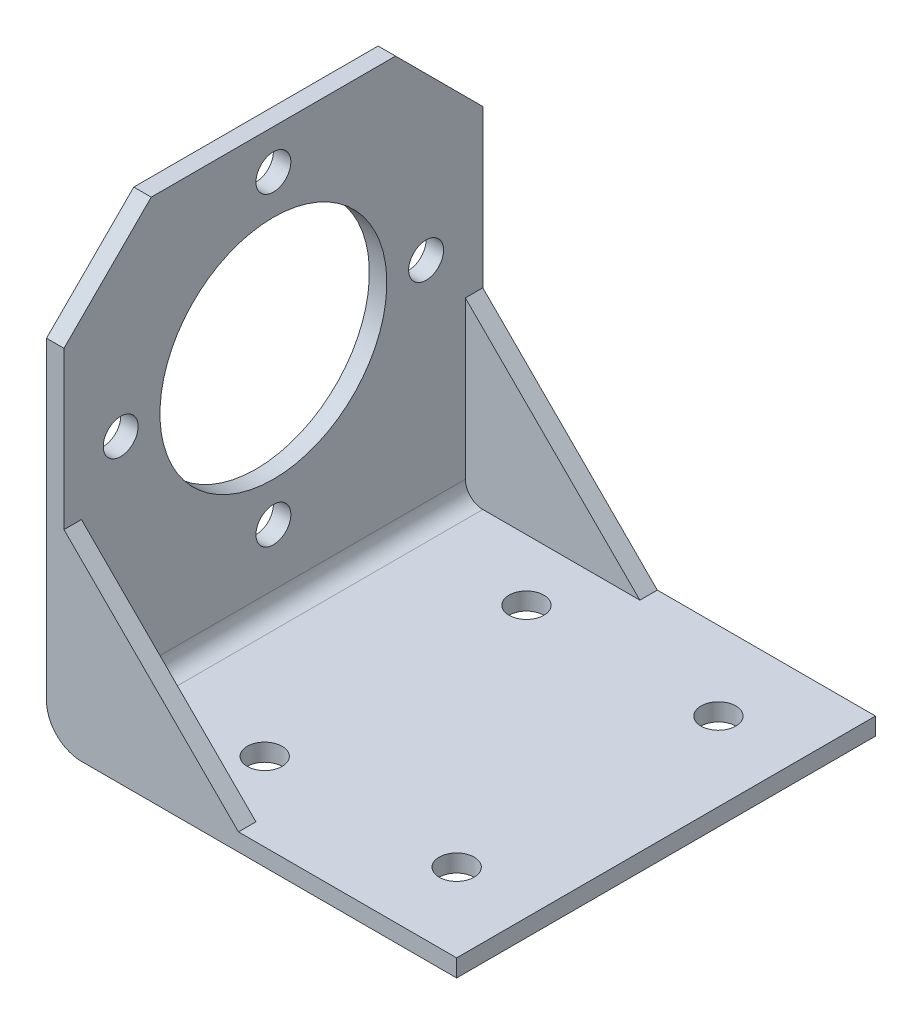
ISO-10303-21;
HEADER;
FILE_DESCRIPTION(('STEP AP214'),'2;1');
FILE_NAME('part.step','',(''),(''),'','','');
FILE_SCHEMA(('AUTOMOTIVE_DESIGN { 1 0 10303 214 1 1 1 1 }'));
ENDSEC;
DATA;
#1=APPLICATION_CONTEXT('core data for automotive mechanical design processes');
#2=APPLICATION_PROTOCOL_DEFINITION('international standard','automotive_design',2000,#1);
#3=PRODUCT_CONTEXT('',#1,'mechanical');
#4=PRODUCT('Part','Part','',(#3));
#5=PRODUCT_RELATED_PRODUCT_CATEGORY('part','',(#4));
#6=PRODUCT_DEFINITION_FORMATION('','',#4);
#7=PRODUCT_DEFINITION_CONTEXT('part definition',#1,'design');
#8=PRODUCT_DEFINITION('design','',#6,#7);
#9=PRODUCT_DEFINITION_SHAPE('','',#8);
#10=(LENGTH_UNIT() NAMED_UNIT(*) SI_UNIT(.MILLI.,.METRE.));
#11=(NAMED_UNIT(*) PLANE_ANGLE_UNIT() SI_UNIT($,.RADIAN.));
#12=(NAMED_UNIT(*) SI_UNIT($,.STERADIAN.) SOLID_ANGLE_UNIT());
#13=UNCERTAINTY_MEASURE_WITH_UNIT(LENGTH_MEASURE(1.E-05),#10,'distance_accuracy_value','');
#14=(GEOMETRIC_REPRESENTATION_CONTEXT(3) GLOBAL_UNCERTAINTY_ASSIGNED_CONTEXT((#13)) GLOBAL_UNIT_ASSIGNED_CONTEXT((#10,
#11,#12)) REPRESENTATION_CONTEXT('',''));
#15=CARTESIAN_POINT('',(0.,0.,0.));
#16=DIRECTION('',(0.,0.,1.));
#17=DIRECTION('',(1.,0.,0.));
#18=AXIS2_PLACEMENT_3D('',#15,#16,#17);
#19=CARTESIAN_POINT('',(4.,4.,48.));
#20=DIRECTION('',(0.,0.,-1.));
#21=DIRECTION('',(-1.,0.,0.));
#22=AXIS2_PLACEMENT_3D('',#19,#20,#21);
#23=CYLINDRICAL_SURFACE('',#22,2.);
#24=DIRECTION('',(0.,0.,-1.));
#25=VECTOR('',#24,1.);
#26=CARTESIAN_POINT('',(4.,2.,48.));
#27=LINE('',#26,#25);
#28=CARTESIAN_POINT('',(4.,2.,46.));
#29=VERTEX_POINT('',#28);
#30=CARTESIAN_POINT('',(4.,2.,2.));
#31=VERTEX_POINT('',#30);
#32=EDGE_CURVE('E290',#29,#31,#27,.T.);
#33=ORIENTED_EDGE('',*,*,#32,.T.);
#34=CARTESIAN_POINT('',(4.,4.,2.));
#35=DIRECTION('',(0.,0.,1.));
#36=DIRECTION('',(1.,0.,0.));
#37=AXIS2_PLACEMENT_3D('',#34,#35,#36);
#38=CIRCLE('',#37,2.);
#39=CARTESIAN_POINT('',(2.,4.,2.));
#40=VERTEX_POINT('',#39);
#41=EDGE_CURVE('E181',#40,#31,#38,.T.);
#42=ORIENTED_EDGE('',*,*,#41,.F.);
#43=DIRECTION('',(0.,0.,-1.));
#44=VECTOR('',#43,1.);
#45=CARTESIAN_POINT('',(2.,4.,48.));
#46=LINE('',#45,#44);
#47=CARTESIAN_POINT('',(2.,4.,46.));
#48=VERTEX_POINT('',#47);
#49=EDGE_CURVE('E185',#48,#40,#46,.T.);
#50=ORIENTED_EDGE('',*,*,#49,.F.);
#51=CARTESIAN_POINT('',(4.,4.,46.));
#52=DIRECTION('',(0.,0.,1.));
#53=DIRECTION('',(1.,0.,0.));
#54=AXIS2_PLACEMENT_3D('',#51,#52,#53);
#55=CIRCLE('',#54,2.);
#56=EDGE_CURVE('E69',#48,#29,#55,.T.);
#57=ORIENTED_EDGE('',*,*,#56,.T.);
#58=EDGE_LOOP('',(#33,#42,#50,#57));
#59=FACE_BOUND('',#58,.T.);
#60=ADVANCED_FACE('F45',(#59),#23,.F.);
#61=CARTESIAN_POINT('',(0.,2.,48.));
#62=DIRECTION('',(0.,1.,0.));
#63=DIRECTION('',(0.,0.,1.));
#64=AXIS2_PLACEMENT_3D('',#61,#62,#63);
#65=PLANE('',#64);
#66=CARTESIAN_POINT('',(38.,2.,39.));
#67=DIRECTION('',(0.,1.,0.));
#68=DIRECTION('',(0.,0.,-1.));
#69=AXIS2_PLACEMENT_3D('',#66,#67,#68);
#70=CIRCLE('',#69,2.);
#71=CARTESIAN_POINT('',(38.,2.,37.));
#72=VERTEX_POINT('',#71);
#73=EDGE_CURVE('E228',#72,#72,#70,.T.);
#74=ORIENTED_EDGE('',*,*,#73,.F.);
#75=EDGE_LOOP('',(#74));
#76=FACE_BOUND('',#75,.T.);
#77=CARTESIAN_POINT('',(16.,2.,9.));
#78=DIRECTION('',(0.,1.,0.));
#79=DIRECTION('',(0.,0.,1.));
#80=AXIS2_PLACEMENT_3D('',#77,#78,#79);
#81=CIRCLE('',#80,2.);
#82=CARTESIAN_POINT('',(16.,2.,11.));
#83=VERTEX_POINT('',#82);
#84=EDGE_CURVE('E226',#83,#83,#81,.T.);
#85=ORIENTED_EDGE('',*,*,#84,.F.);
#86=EDGE_LOOP('',(#85));
#87=FACE_BOUND('',#86,.T.);
#88=CARTESIAN_POINT('',(16.,2.,39.));
#89=DIRECTION('',(0.,1.,0.));
#90=DIRECTION('',(0.,0.,-1.));
#91=AXIS2_PLACEMENT_3D('',#88,#89,#90);
#92=CIRCLE('',#91,2.);
#93=CARTESIAN_POINT('',(16.,2.,37.));
#94=VERTEX_POINT('',#93);
#95=EDGE_CURVE('E223',#94,#94,#92,.T.);
#96=ORIENTED_EDGE('',*,*,#95,.F.);
#97=EDGE_LOOP('',(#96));
#98=FACE_BOUND('',#97,.T.);
#99=CARTESIAN_POINT('',(38.,2.,9.));
#100=DIRECTION('',(0.,1.,0.));
#101=DIRECTION('',(0.,0.,1.));
#102=AXIS2_PLACEMENT_3D('',#99,#100,#101);
#103=CIRCLE('',#102,2.);
#104=CARTESIAN_POINT('',(38.,2.,11.));
#105=VERTEX_POINT('',#104);
#106=EDGE_CURVE('E231',#105,#105,#103,.T.);
#107=ORIENTED_EDGE('',*,*,#106,.F.);
#108=EDGE_LOOP('',(#107));
#109=FACE_BOUND('',#108,.T.);
#110=DIRECTION('',(1.,0.,0.));
#111=VECTOR('',#110,1.);
#112=CARTESIAN_POINT('',(0.,2.,0.));
#113=LINE('',#112,#111);
#114=CARTESIAN_POINT('',(22.,2.,0.));
#115=VERTEX_POINT('',#114);
#116=CARTESIAN_POINT('',(47.,2.,0.));
#117=VERTEX_POINT('',#116);
#118=EDGE_CURVE('E270',#115,#117,#113,.T.);
#119=ORIENTED_EDGE('',*,*,#118,.F.);
#120=DIRECTION('',(0.,0.,-1.));
#121=VECTOR('',#120,1.);
#122=CARTESIAN_POINT('',(22.,2.,2.));
#123=LINE('',#122,#121);
#124=CARTESIAN_POINT('',(22.,2.,2.));
#125=VERTEX_POINT('',#124);
#126=EDGE_CURVE('E180',#125,#115,#123,.T.);
#127=ORIENTED_EDGE('',*,*,#126,.F.);
#128=DIRECTION('',(1.,0.,0.));
#129=VECTOR('',#128,1.);
#130=CARTESIAN_POINT('',(4.,2.,2.));
#131=LINE('',#130,#129);
#132=EDGE_CURVE('E168',#31,#125,#131,.T.);
#133=ORIENTED_EDGE('',*,*,#132,.F.);
#134=ORIENTED_EDGE('',*,*,#32,.F.);
#135=DIRECTION('',(1.,0.,0.));
#136=VECTOR('',#135,1.);
#137=CARTESIAN_POINT('',(4.,2.,46.));
#138=LINE('',#137,#136);
#139=CARTESIAN_POINT('',(22.,2.,46.));
#140=VERTEX_POINT('',#139);
#141=EDGE_CURVE('E61',#29,#140,#138,.T.);
#142=ORIENTED_EDGE('',*,*,#141,.T.);
#143=DIRECTION('',(0.,0.,1.));
#144=VECTOR('',#143,1.);
#145=CARTESIAN_POINT('',(22.,2.,46.));
#146=LINE('',#145,#144);
#147=CARTESIAN_POINT('',(22.,2.,48.));
#148=VERTEX_POINT('',#147);
#149=EDGE_CURVE('E200',#140,#148,#146,.T.);
#150=ORIENTED_EDGE('',*,*,#149,.T.);
#151=DIRECTION('',(1.,0.,0.));
#152=VECTOR('',#151,1.);
#153=CARTESIAN_POINT('',(0.,2.,48.));
#154=LINE('',#153,#152);
#155=CARTESIAN_POINT('',(47.,2.,48.));
#156=VERTEX_POINT('',#155);
#157=EDGE_CURVE('E255',#148,#156,#154,.T.);
#158=ORIENTED_EDGE('',*,*,#157,.T.);
#159=DIRECTION('',(0.,0.,-1.));
#160=VECTOR('',#159,1.);
#161=CARTESIAN_POINT('',(47.,2.,48.));
#162=LINE('',#161,#160);
#163=EDGE_CURVE('E292',#156,#117,#162,.T.);
#164=ORIENTED_EDGE('',*,*,#163,.T.);
#165=EDGE_LOOP('',(#119,#127,#133,#134,#142,#150,#158,#164));
#166=FACE_BOUND('',#165,.T.);
#167=ADVANCED_FACE('F366',(#76,#87,#98,#109,#166),#65,.T.);
#168=CARTESIAN_POINT('',(2.,50.,48.));
#169=DIRECTION('',(1.,0.,0.));
#170=DIRECTION('',(0.,1.,0.));
#171=AXIS2_PLACEMENT_3D('',#168,#169,#170);
#172=PLANE('',#171);
#173=CARTESIAN_POINT('',(2.,45.5,24.));
#174=DIRECTION('',(1.,0.,0.));
#175=DIRECTION('',(0.,1.,0.));
#176=AXIS2_PLACEMENT_3D('',#173,#174,#175);
#177=CIRCLE('',#176,2.);
#178=CARTESIAN_POINT('',(2.,47.5,24.));
#179=VERTEX_POINT('',#178);
#180=EDGE_CURVE('E214',#179,#179,#177,.T.);
#181=ORIENTED_EDGE('',*,*,#180,.F.);
#182=EDGE_LOOP('',(#181));
#183=FACE_BOUND('',#182,.T.);
#184=CARTESIAN_POINT('',(2.,28.,6.5));
#185=DIRECTION('',(1.,0.,0.));
#186=DIRECTION('',(0.,1.,0.));
#187=AXIS2_PLACEMENT_3D('',#184,#185,#186);
#188=CIRCLE('',#187,2.);
#189=CARTESIAN_POINT('',(2.,30.,6.5));
#190=VERTEX_POINT('',#189);
#191=EDGE_CURVE('E211',#190,#190,#188,.T.);
#192=ORIENTED_EDGE('',*,*,#191,.F.);
#193=EDGE_LOOP('',(#192));
#194=FACE_BOUND('',#193,.T.);
#195=CARTESIAN_POINT('',(2.,10.5,24.));
#196=DIRECTION('',(1.,0.,0.));
#197=DIRECTION('',(0.,1.,0.));
#198=AXIS2_PLACEMENT_3D('',#195,#196,#197);
#199=CIRCLE('',#198,2.);
#200=CARTESIAN_POINT('',(2.,12.5,24.));
#201=VERTEX_POINT('',#200);
#202=EDGE_CURVE('E208',#201,#201,#199,.T.);
#203=ORIENTED_EDGE('',*,*,#202,.F.);
#204=EDGE_LOOP('',(#203));
#205=FACE_BOUND('',#204,.T.);
#206=CARTESIAN_POINT('',(2.,28.,41.5));
#207=DIRECTION('',(1.,0.,0.));
#208=DIRECTION('',(0.,1.,0.));
#209=AXIS2_PLACEMENT_3D('',#206,#207,#208);
#210=CIRCLE('',#209,2.);
#211=CARTESIAN_POINT('',(2.,30.,41.5));
#212=VERTEX_POINT('',#211);
#213=EDGE_CURVE('E206',#212,#212,#210,.T.);
#214=ORIENTED_EDGE('',*,*,#213,.F.);
#215=EDGE_LOOP('',(#214));
#216=FACE_BOUND('',#215,.T.);
#217=CARTESIAN_POINT('',(2.,28.,24.));
#218=DIRECTION('',(1.,0.,0.));
#219=DIRECTION('',(0.,1.,0.));
#220=AXIS2_PLACEMENT_3D('',#217,#218,#219);
#221=CIRCLE('',#220,13.);
#222=CARTESIAN_POINT('',(2.,41.,24.));
#223=VERTEX_POINT('',#222);
#224=EDGE_CURVE('E217',#223,#223,#221,.T.);
#225=ORIENTED_EDGE('',*,*,#224,.F.);
#226=EDGE_LOOP('',(#225));
#227=FACE_BOUND('',#226,.T.);
#228=DIRECTION('',(0.,-1.,0.));
#229=VECTOR('',#228,1.);
#230=CARTESIAN_POINT('',(2.,22.,2.));
#231=LINE('',#230,#229);
#232=CARTESIAN_POINT('',(2.,22.,2.));
#233=VERTEX_POINT('',#232);
#234=EDGE_CURVE('E165',#233,#40,#231,.T.);
#235=ORIENTED_EDGE('',*,*,#234,.F.);
#236=DIRECTION('',(0.,0.,-1.));
#237=VECTOR('',#236,1.);
#238=CARTESIAN_POINT('',(2.,22.,2.));
#239=LINE('',#238,#237);
#240=CARTESIAN_POINT('',(2.,22.,0.));
#241=VERTEX_POINT('',#240);
#242=EDGE_CURVE('E173',#233,#241,#239,.T.);
#243=ORIENTED_EDGE('',*,*,#242,.T.);
#244=DIRECTION('',(0.,-1.,0.));
#245=VECTOR('',#244,1.);
#246=CARTESIAN_POINT('',(2.,50.,0.));
#247=LINE('',#246,#245);
#248=CARTESIAN_POINT('',(2.,40.,0.));
#249=VERTEX_POINT('',#248);
#250=EDGE_CURVE('E272',#249,#241,#247,.T.);
#251=ORIENTED_EDGE('',*,*,#250,.F.);
#252=DIRECTION('',(0.,0.707106781186547,0.707106781186548));
#253=VECTOR('',#252,1.);
#254=CARTESIAN_POINT('',(2.,69.,29.0000000000001));
#255=LINE('',#254,#253);
#256=CARTESIAN_POINT('',(2.,50.,10.));
#257=VERTEX_POINT('',#256);
#258=EDGE_CURVE('E324',#249,#257,#255,.T.);
#259=ORIENTED_EDGE('',*,*,#258,.T.);
#260=DIRECTION('',(0.,0.,-1.));
#261=VECTOR('',#260,1.);
#262=CARTESIAN_POINT('',(2.,50.,48.));
#263=LINE('',#262,#261);
#264=CARTESIAN_POINT('',(2.,50.,38.));
#265=VERTEX_POINT('',#264);
#266=EDGE_CURVE('E286',#265,#257,#263,.T.);
#267=ORIENTED_EDGE('',*,*,#266,.F.);
#268=DIRECTION('',(0.,0.707106781186548,-0.707106781186547));
#269=VECTOR('',#268,1.);
#270=CARTESIAN_POINT('',(2.,45.,43.));
#271=LINE('',#270,#269);
#272=CARTESIAN_POINT('',(2.,40.,48.));
#273=VERTEX_POINT('',#272);
#274=EDGE_CURVE('E326',#265,#273,#271,.F.);
#275=ORIENTED_EDGE('',*,*,#274,.T.);
#276=DIRECTION('',(0.,-1.,0.));
#277=VECTOR('',#276,1.);
#278=CARTESIAN_POINT('',(2.,50.,48.));
#279=LINE('',#278,#277);
#280=CARTESIAN_POINT('',(2.,22.,48.));
#281=VERTEX_POINT('',#280);
#282=EDGE_CURVE('E257',#273,#281,#279,.T.);
#283=ORIENTED_EDGE('',*,*,#282,.T.);
#284=DIRECTION('',(0.,0.,1.));
#285=VECTOR('',#284,1.);
#286=CARTESIAN_POINT('',(2.,22.,46.));
#287=LINE('',#286,#285);
#288=CARTESIAN_POINT('',(2.,22.,46.));
#289=VERTEX_POINT('',#288);
#290=EDGE_CURVE('E203',#289,#281,#287,.T.);
#291=ORIENTED_EDGE('',*,*,#290,.F.);
#292=DIRECTION('',(0.,-1.,0.));
#293=VECTOR('',#292,1.);
#294=CARTESIAN_POINT('',(2.,22.,46.));
#295=LINE('',#294,#293);
#296=EDGE_CURVE('E193',#289,#48,#295,.T.);
#297=ORIENTED_EDGE('',*,*,#296,.T.);
#298=ORIENTED_EDGE('',*,*,#49,.T.);
#299=EDGE_LOOP('',(#235,#243,#251,#259,#267,#275,#283,#291,#297,#298));
#300=FACE_BOUND('',#299,.T.);
#301=ADVANCED_FACE('F184',(#183,#194,#205,#216,#227,#300),#172,.T.);
#302=CARTESIAN_POINT('',(0.,0.,48.));
#303=DIRECTION('',(0.,1.,0.));
#304=DIRECTION('',(0.,0.,1.));
#305=AXIS2_PLACEMENT_3D('',#302,#303,#304);
#306=PLANE('',#305);
#307=CARTESIAN_POINT('',(38.,0.,39.));
#308=DIRECTION('',(0.,1.,0.));
#309=DIRECTION('',(0.,0.,1.));
#310=AXIS2_PLACEMENT_3D('',#307,#308,#309);
#311=CIRCLE('',#310,2.);
#312=CARTESIAN_POINT('',(38.,0.,41.));
#313=VERTEX_POINT('',#312);
#314=EDGE_CURVE('E245',#313,#313,#311,.T.);
#315=ORIENTED_EDGE('',*,*,#314,.T.);
#316=EDGE_LOOP('',(#315));
#317=FACE_BOUND('',#316,.T.);
#318=CARTESIAN_POINT('',(16.,0.,9.));
#319=DIRECTION('',(0.,1.,0.));
#320=DIRECTION('',(0.,0.,1.));
#321=AXIS2_PLACEMENT_3D('',#318,#319,#320);
#322=CIRCLE('',#321,2.);
#323=CARTESIAN_POINT('',(16.,0.,11.));
#324=VERTEX_POINT('',#323);
#325=EDGE_CURVE('E242',#324,#324,#322,.T.);
#326=ORIENTED_EDGE('',*,*,#325,.T.);
#327=EDGE_LOOP('',(#326));
#328=FACE_BOUND('',#327,.T.);
#329=CARTESIAN_POINT('',(16.,0.,39.));
#330=DIRECTION('',(0.,1.,0.));
#331=DIRECTION('',(0.,0.,1.));
#332=AXIS2_PLACEMENT_3D('',#329,#330,#331);
#333=CIRCLE('',#332,2.);
#334=CARTESIAN_POINT('',(16.,0.,41.));
#335=VERTEX_POINT('',#334);
#336=EDGE_CURVE('E239',#335,#335,#333,.T.);
#337=ORIENTED_EDGE('',*,*,#336,.T.);
#338=EDGE_LOOP('',(#337));
#339=FACE_BOUND('',#338,.T.);
#340=CARTESIAN_POINT('',(38.,0.,9.));
#341=DIRECTION('',(0.,1.,0.));
#342=DIRECTION('',(0.,0.,1.));
#343=AXIS2_PLACEMENT_3D('',#340,#341,#342);
#344=CIRCLE('',#343,2.);
#345=CARTESIAN_POINT('',(38.,0.,11.));
#346=VERTEX_POINT('',#345);
#347=EDGE_CURVE('E236',#346,#346,#344,.T.);
#348=ORIENTED_EDGE('',*,*,#347,.T.);
#349=EDGE_LOOP('',(#348));
#350=FACE_BOUND('',#349,.T.);
#351=DIRECTION('',(1.,0.,0.));
#352=VECTOR('',#351,1.);
#353=CARTESIAN_POINT('',(0.,0.,0.));
#354=LINE('',#353,#352);
#355=CARTESIAN_POINT('',(4.,0.,0.));
#356=VERTEX_POINT('',#355);
#357=CARTESIAN_POINT('',(47.,0.,0.));
#358=VERTEX_POINT('',#357);
#359=EDGE_CURVE('E248',#356,#358,#354,.T.);
#360=ORIENTED_EDGE('',*,*,#359,.T.);
#361=DIRECTION('',(0.,0.,-1.));
#362=VECTOR('',#361,1.);
#363=CARTESIAN_POINT('',(47.,0.,48.));
#364=LINE('',#363,#362);
#365=CARTESIAN_POINT('',(47.,0.,48.));
#366=VERTEX_POINT('',#365);
#367=EDGE_CURVE('E295',#366,#358,#364,.T.);
#368=ORIENTED_EDGE('',*,*,#367,.F.);
#369=DIRECTION('',(1.,0.,0.));
#370=VECTOR('',#369,1.);
#371=CARTESIAN_POINT('',(0.,0.,48.));
#372=LINE('',#371,#370);
#373=CARTESIAN_POINT('',(4.,0.,48.));
#374=VERTEX_POINT('',#373);
#375=EDGE_CURVE('E249',#374,#366,#372,.T.);
#376=ORIENTED_EDGE('',*,*,#375,.F.);
#377=DIRECTION('',(0.,0.,-1.));
#378=VECTOR('',#377,1.);
#379=CARTESIAN_POINT('',(4.,0.,48.));
#380=LINE('',#379,#378);
#381=EDGE_CURVE('E264',#374,#356,#380,.T.);
#382=ORIENTED_EDGE('',*,*,#381,.T.);
#383=EDGE_LOOP('',(#360,#368,#376,#382));
#384=FACE_BOUND('',#383,.T.);
#385=ADVANCED_FACE('F379',(#317,#328,#339,#350,#384),#306,.F.);
#386=CARTESIAN_POINT('',(47.,2.,48.));
#387=DIRECTION('',(1.,0.,0.));
#388=DIRECTION('',(0.,0.,-1.));
#389=AXIS2_PLACEMENT_3D('',#386,#387,#388);
#390=PLANE('',#389);
#391=DIRECTION('',(0.,-1.,0.));
#392=VECTOR('',#391,1.);
#393=CARTESIAN_POINT('',(47.,2.,0.));
#394=LINE('',#393,#392);
#395=EDGE_CURVE('E267',#117,#358,#394,.T.);
#396=ORIENTED_EDGE('',*,*,#395,.F.);
#397=ORIENTED_EDGE('',*,*,#163,.F.);
#398=DIRECTION('',(0.,-1.,0.));
#399=VECTOR('',#398,1.);
#400=CARTESIAN_POINT('',(47.,2.,48.));
#401=LINE('',#400,#399);
#402=EDGE_CURVE('E251',#156,#366,#401,.T.);
#403=ORIENTED_EDGE('',*,*,#402,.T.);
#404=ORIENTED_EDGE('',*,*,#367,.T.);
#405=EDGE_LOOP('',(#396,#397,#403,#404));
#406=FACE_BOUND('',#405,.T.);
#407=ADVANCED_FACE('F376',(#406),#390,.T.);
#408=CARTESIAN_POINT('',(0.,50.,48.));
#409=DIRECTION('',(0.,1.,0.));
#410=DIRECTION('',(0.,0.,1.));
#411=AXIS2_PLACEMENT_3D('',#408,#409,#410);
#412=PLANE('',#411);
#413=DIRECTION('',(0.,0.,-1.));
#414=VECTOR('',#413,1.);
#415=CARTESIAN_POINT('',(0.,50.,48.));
#416=LINE('',#415,#414);
#417=CARTESIAN_POINT('',(0.,50.,38.));
#418=VERTEX_POINT('',#417);
#419=CARTESIAN_POINT('',(0.,50.,10.));
#420=VERTEX_POINT('',#419);
#421=EDGE_CURVE('E283',#418,#420,#416,.T.);
#422=ORIENTED_EDGE('',*,*,#421,.F.);
#423=DIRECTION('',(1.,0.,0.));
#424=VECTOR('',#423,1.);
#425=CARTESIAN_POINT('',(0.,50.,38.));
#426=LINE('',#425,#424);
#427=EDGE_CURVE('E321',#418,#265,#426,.T.);
#428=ORIENTED_EDGE('',*,*,#427,.T.);
#429=ORIENTED_EDGE('',*,*,#266,.T.);
#430=DIRECTION('',(-1.,0.,0.));
#431=VECTOR('',#430,1.);
#432=CARTESIAN_POINT('',(0.,50.,10.));
#433=LINE('',#432,#431);
#434=EDGE_CURVE('E306',#257,#420,#433,.T.);
#435=ORIENTED_EDGE('',*,*,#434,.T.);
#436=EDGE_LOOP('',(#422,#428,#429,#435));
#437=FACE_BOUND('',#436,.T.);
#438=ADVANCED_FACE('F342',(#437),#412,.T.);
#439=CARTESIAN_POINT('',(0.,50.,48.));
#440=DIRECTION('',(1.,0.,0.));
#441=DIRECTION('',(0.,1.,0.));
#442=AXIS2_PLACEMENT_3D('',#439,#440,#441);
#443=PLANE('',#442);
#444=CARTESIAN_POINT('',(0.,45.5,24.));
#445=DIRECTION('',(1.,0.,0.));
#446=DIRECTION('',(0.,1.,0.));
#447=AXIS2_PLACEMENT_3D('',#444,#445,#446);
#448=CIRCLE('',#447,2.);
#449=CARTESIAN_POINT('',(0.,47.5,24.));
#450=VERTEX_POINT('',#449);
#451=EDGE_CURVE('E227',#450,#450,#448,.T.);
#452=ORIENTED_EDGE('',*,*,#451,.T.);
#453=EDGE_LOOP('',(#452));
#454=FACE_BOUND('',#453,.T.);
#455=CARTESIAN_POINT('',(0.,28.,6.5));
#456=DIRECTION('',(1.,0.,0.));
#457=DIRECTION('',(0.,1.,0.));
#458=AXIS2_PLACEMENT_3D('',#455,#456,#457);
#459=CIRCLE('',#458,2.);
#460=CARTESIAN_POINT('',(0.,30.,6.5));
#461=VERTEX_POINT('',#460);
#462=EDGE_CURVE('E315',#461,#461,#459,.T.);
#463=ORIENTED_EDGE('',*,*,#462,.T.);
#464=EDGE_LOOP('',(#463));
#465=FACE_BOUND('',#464,.T.);
#466=CARTESIAN_POINT('',(0.,10.5,24.));
#467=DIRECTION('',(1.,0.,0.));
#468=DIRECTION('',(0.,1.,0.));
#469=AXIS2_PLACEMENT_3D('',#466,#467,#468);
#470=CIRCLE('',#469,2.);
#471=CARTESIAN_POINT('',(0.,12.5,24.));
#472=VERTEX_POINT('',#471);
#473=EDGE_CURVE('E312',#472,#472,#470,.T.);
#474=ORIENTED_EDGE('',*,*,#473,.T.);
#475=EDGE_LOOP('',(#474));
#476=FACE_BOUND('',#475,.T.);
#477=CARTESIAN_POINT('',(0.,28.,41.5));
#478=DIRECTION('',(1.,0.,0.));
#479=DIRECTION('',(0.,1.,0.));
#480=AXIS2_PLACEMENT_3D('',#477,#478,#479);
#481=CIRCLE('',#480,2.);
#482=CARTESIAN_POINT('',(0.,30.,41.5));
#483=VERTEX_POINT('',#482);
#484=EDGE_CURVE('E309',#483,#483,#481,.T.);
#485=ORIENTED_EDGE('',*,*,#484,.T.);
#486=EDGE_LOOP('',(#485));
#487=FACE_BOUND('',#486,.T.);
#488=CARTESIAN_POINT('',(0.,28.,24.));
#489=DIRECTION('',(1.,0.,0.));
#490=DIRECTION('',(0.,1.,0.));
#491=AXIS2_PLACEMENT_3D('',#488,#489,#490);
#492=CIRCLE('',#491,13.);
#493=CARTESIAN_POINT('',(0.,41.,24.));
#494=VERTEX_POINT('',#493);
#495=EDGE_CURVE('E222',#494,#494,#492,.T.);
#496=ORIENTED_EDGE('',*,*,#495,.T.);
#497=EDGE_LOOP('',(#496));
#498=FACE_BOUND('',#497,.T.);
#499=DIRECTION('',(0.,-1.,0.));
#500=VECTOR('',#499,1.);
#501=CARTESIAN_POINT('',(0.,50.,48.));
#502=LINE('',#501,#500);
#503=CARTESIAN_POINT('',(0.,40.,48.));
#504=VERTEX_POINT('',#503);
#505=CARTESIAN_POINT('',(0.,4.,48.));
#506=VERTEX_POINT('',#505);
#507=EDGE_CURVE('E259',#504,#506,#502,.T.);
#508=ORIENTED_EDGE('',*,*,#507,.F.);
#509=DIRECTION('',(0.,-0.707106781186548,0.707106781186547));
#510=VECTOR('',#509,1.);
#511=CARTESIAN_POINT('',(0.,50.,38.));
#512=LINE('',#511,#510);
#513=EDGE_CURVE('E54',#504,#418,#512,.F.);
#514=ORIENTED_EDGE('',*,*,#513,.T.);
#515=ORIENTED_EDGE('',*,*,#421,.T.);
#516=DIRECTION('',(0.,-0.707106781186547,-0.707106781186548));
#517=VECTOR('',#516,1.);
#518=CARTESIAN_POINT('',(0.,40.,0.));
#519=LINE('',#518,#517);
#520=CARTESIAN_POINT('',(0.,40.,0.));
#521=VERTEX_POINT('',#520);
#522=EDGE_CURVE('E330',#420,#521,#519,.T.);
#523=ORIENTED_EDGE('',*,*,#522,.T.);
#524=DIRECTION('',(0.,-1.,0.));
#525=VECTOR('',#524,1.);
#526=CARTESIAN_POINT('',(0.,50.,0.));
#527=LINE('',#526,#525);
#528=CARTESIAN_POINT('',(0.,4.,0.));
#529=VERTEX_POINT('',#528);
#530=EDGE_CURVE('E274',#521,#529,#527,.T.);
#531=ORIENTED_EDGE('',*,*,#530,.T.);
#532=DIRECTION('',(0.,0.,-1.));
#533=VECTOR('',#532,1.);
#534=CARTESIAN_POINT('',(0.,4.,48.));
#535=LINE('',#534,#533);
#536=EDGE_CURVE('E280',#506,#529,#535,.T.);
#537=ORIENTED_EDGE('',*,*,#536,.F.);
#538=EDGE_LOOP('',(#508,#514,#515,#523,#531,#537));
#539=FACE_BOUND('',#538,.T.);
#540=ADVANCED_FACE('F335',(#454,#465,#476,#487,#498,#539),#443,.F.);
#541=CARTESIAN_POINT('',(4.,4.,48.));
#542=DIRECTION('',(0.,0.,-1.));
#543=DIRECTION('',(-1.,0.,0.));
#544=AXIS2_PLACEMENT_3D('',#541,#542,#543);
#545=CYLINDRICAL_SURFACE('',#544,4.);
#546=CARTESIAN_POINT('',(4.,4.,0.));
#547=DIRECTION('',(0.,0.,-1.));
#548=DIRECTION('',(-1.,0.,0.));
#549=AXIS2_PLACEMENT_3D('',#546,#547,#548);
#550=CIRCLE('',#549,4.);
#551=EDGE_CURVE('E252',#529,#356,#550,.F.);
#552=ORIENTED_EDGE('',*,*,#551,.T.);
#553=ORIENTED_EDGE('',*,*,#381,.F.);
#554=CARTESIAN_POINT('',(4.,4.,48.));
#555=DIRECTION('',(0.,0.,-1.));
#556=DIRECTION('',(-1.,0.,0.));
#557=AXIS2_PLACEMENT_3D('',#554,#555,#556);
#558=CIRCLE('',#557,4.);
#559=EDGE_CURVE('E261',#506,#374,#558,.F.);
#560=ORIENTED_EDGE('',*,*,#559,.F.);
#561=ORIENTED_EDGE('',*,*,#536,.T.);
#562=EDGE_LOOP('',(#552,#553,#560,#561));
#563=FACE_BOUND('',#562,.T.);
#564=ADVANCED_FACE('F432',(#563),#545,.T.);
#565=CARTESIAN_POINT('',(4.,4.,48.));
#566=DIRECTION('',(0.,0.,1.));
#567=DIRECTION('',(1.,0.,0.));
#568=AXIS2_PLACEMENT_3D('',#565,#566,#567);
#569=PLANE('',#568);
#570=ORIENTED_EDGE('',*,*,#375,.T.);
#571=ORIENTED_EDGE('',*,*,#402,.F.);
#572=ORIENTED_EDGE('',*,*,#157,.F.);
#573=DIRECTION('',(-0.707106781186548,0.707106781186547,0.));
#574=VECTOR('',#573,1.);
#575=CARTESIAN_POINT('',(2.,22.,48.));
#576=LINE('',#575,#574);
#577=EDGE_CURVE('E191',#148,#281,#576,.T.);
#578=ORIENTED_EDGE('',*,*,#577,.T.);
#579=ORIENTED_EDGE('',*,*,#282,.F.);
#580=DIRECTION('',(-1.,0.,0.));
#581=VECTOR('',#580,1.);
#582=CARTESIAN_POINT('',(4.,40.,48.));
#583=LINE('',#582,#581);
#584=EDGE_CURVE('E328',#273,#504,#583,.T.);
#585=ORIENTED_EDGE('',*,*,#584,.T.);
#586=ORIENTED_EDGE('',*,*,#507,.T.);
#587=ORIENTED_EDGE('',*,*,#559,.T.);
#588=EDGE_LOOP('',(#570,#571,#572,#578,#579,#585,#586,#587));
#589=FACE_BOUND('',#588,.T.);
#590=ADVANCED_FACE('F348',(#589),#569,.T.);
#591=CARTESIAN_POINT('',(4.,4.,0.));
#592=DIRECTION('',(0.,0.,1.));
#593=DIRECTION('',(1.,0.,0.));
#594=AXIS2_PLACEMENT_3D('',#591,#592,#593);
#595=PLANE('',#594);
#596=ORIENTED_EDGE('',*,*,#530,.F.);
#597=DIRECTION('',(1.,0.,0.));
#598=VECTOR('',#597,1.);
#599=CARTESIAN_POINT('',(2.,40.,0.));
#600=LINE('',#599,#598);
#601=EDGE_CURVE('E11',#521,#249,#600,.T.);
#602=ORIENTED_EDGE('',*,*,#601,.T.);
#603=ORIENTED_EDGE('',*,*,#250,.T.);
#604=DIRECTION('',(-0.707106781186548,0.707106781186547,0.));
#605=VECTOR('',#604,1.);
#606=CARTESIAN_POINT('',(2.,22.,0.));
#607=LINE('',#606,#605);
#608=EDGE_CURVE('E176',#115,#241,#607,.T.);
#609=ORIENTED_EDGE('',*,*,#608,.F.);
#610=ORIENTED_EDGE('',*,*,#118,.T.);
#611=ORIENTED_EDGE('',*,*,#395,.T.);
#612=ORIENTED_EDGE('',*,*,#359,.F.);
#613=ORIENTED_EDGE('',*,*,#551,.F.);
#614=EDGE_LOOP('',(#596,#602,#603,#609,#610,#611,#612,#613));
#615=FACE_BOUND('',#614,.T.);
#616=ADVANCED_FACE('F428',(#615),#595,.F.);
#617=CARTESIAN_POINT('',(38.,-8.,9.));
#618=DIRECTION('',(0.,1.,0.));
#619=DIRECTION('',(0.,0.,1.));
#620=AXIS2_PLACEMENT_3D('',#617,#618,#619);
#621=CYLINDRICAL_SURFACE('',#620,2.);
#622=ORIENTED_EDGE('',*,*,#106,.T.);
#623=EDGE_LOOP('',(#622));
#624=FACE_BOUND('',#623,.T.);
#625=ORIENTED_EDGE('',*,*,#347,.F.);
#626=EDGE_LOOP('',(#625));
#627=FACE_BOUND('',#626,.T.);
#628=ADVANCED_FACE('F418',(#624,#627),#621,.F.);
#629=CARTESIAN_POINT('',(16.,-8.,39.));
#630=DIRECTION('',(0.,1.,0.));
#631=DIRECTION('',(0.,0.,1.));
#632=AXIS2_PLACEMENT_3D('',#629,#630,#631);
#633=CYLINDRICAL_SURFACE('',#632,2.);
#634=ORIENTED_EDGE('',*,*,#95,.T.);
#635=EDGE_LOOP('',(#634));
#636=FACE_BOUND('',#635,.T.);
#637=ORIENTED_EDGE('',*,*,#336,.F.);
#638=EDGE_LOOP('',(#637));
#639=FACE_BOUND('',#638,.T.);
#640=ADVANCED_FACE('F414',(#636,#639),#633,.F.);
#641=CARTESIAN_POINT('',(16.,-8.,9.));
#642=DIRECTION('',(0.,1.,0.));
#643=DIRECTION('',(0.,0.,1.));
#644=AXIS2_PLACEMENT_3D('',#641,#642,#643);
#645=CYLINDRICAL_SURFACE('',#644,2.);
#646=ORIENTED_EDGE('',*,*,#84,.T.);
#647=EDGE_LOOP('',(#646));
#648=FACE_BOUND('',#647,.T.);
#649=ORIENTED_EDGE('',*,*,#325,.F.);
#650=EDGE_LOOP('',(#649));
#651=FACE_BOUND('',#650,.T.);
#652=ADVANCED_FACE('F417',(#648,#651),#645,.F.);
#653=CARTESIAN_POINT('',(38.,-8.,39.));
#654=DIRECTION('',(0.,1.,0.));
#655=DIRECTION('',(0.,0.,1.));
#656=AXIS2_PLACEMENT_3D('',#653,#654,#655);
#657=CYLINDRICAL_SURFACE('',#656,2.);
#658=ORIENTED_EDGE('',*,*,#73,.T.);
#659=EDGE_LOOP('',(#658));
#660=FACE_BOUND('',#659,.T.);
#661=ORIENTED_EDGE('',*,*,#314,.F.);
#662=EDGE_LOOP('',(#661));
#663=FACE_BOUND('',#662,.T.);
#664=ADVANCED_FACE('F412',(#660,#663),#657,.F.);
#665=CARTESIAN_POINT('',(-8.,28.,24.));
#666=DIRECTION('',(1.,0.,0.));
#667=DIRECTION('',(0.,1.,0.));
#668=AXIS2_PLACEMENT_3D('',#665,#666,#667);
#669=CYLINDRICAL_SURFACE('',#668,13.);
#670=ORIENTED_EDGE('',*,*,#224,.T.);
#671=EDGE_LOOP('',(#670));
#672=FACE_BOUND('',#671,.T.);
#673=ORIENTED_EDGE('',*,*,#495,.F.);
#674=EDGE_LOOP('',(#673));
#675=FACE_BOUND('',#674,.T.);
#676=ADVANCED_FACE('F409',(#672,#675),#669,.F.);
#677=CARTESIAN_POINT('',(-8.,28.,41.5));
#678=DIRECTION('',(1.,0.,0.));
#679=DIRECTION('',(0.,1.,0.));
#680=AXIS2_PLACEMENT_3D('',#677,#678,#679);
#681=CYLINDRICAL_SURFACE('',#680,2.);
#682=ORIENTED_EDGE('',*,*,#213,.T.);
#683=EDGE_LOOP('',(#682));
#684=FACE_BOUND('',#683,.T.);
#685=ORIENTED_EDGE('',*,*,#484,.F.);
#686=EDGE_LOOP('',(#685));
#687=FACE_BOUND('',#686,.T.);
#688=ADVANCED_FACE('F406',(#684,#687),#681,.F.);
#689=CARTESIAN_POINT('',(-8.,10.5,24.));
#690=DIRECTION('',(1.,0.,0.));
#691=DIRECTION('',(0.,1.,0.));
#692=AXIS2_PLACEMENT_3D('',#689,#690,#691);
#693=CYLINDRICAL_SURFACE('',#692,2.);
#694=ORIENTED_EDGE('',*,*,#202,.T.);
#695=EDGE_LOOP('',(#694));
#696=FACE_BOUND('',#695,.T.);
#697=ORIENTED_EDGE('',*,*,#473,.F.);
#698=EDGE_LOOP('',(#697));
#699=FACE_BOUND('',#698,.T.);
#700=ADVANCED_FACE('F401',(#696,#699),#693,.F.);
#701=CARTESIAN_POINT('',(-8.,28.,6.5));
#702=DIRECTION('',(1.,0.,0.));
#703=DIRECTION('',(0.,1.,0.));
#704=AXIS2_PLACEMENT_3D('',#701,#702,#703);
#705=CYLINDRICAL_SURFACE('',#704,2.);
#706=ORIENTED_EDGE('',*,*,#191,.T.);
#707=EDGE_LOOP('',(#706));
#708=FACE_BOUND('',#707,.T.);
#709=ORIENTED_EDGE('',*,*,#462,.F.);
#710=EDGE_LOOP('',(#709));
#711=FACE_BOUND('',#710,.T.);
#712=ADVANCED_FACE('F394',(#708,#711),#705,.F.);
#713=CARTESIAN_POINT('',(-8.,45.5,24.));
#714=DIRECTION('',(1.,0.,0.));
#715=DIRECTION('',(0.,1.,0.));
#716=AXIS2_PLACEMENT_3D('',#713,#714,#715);
#717=CYLINDRICAL_SURFACE('',#716,2.);
#718=ORIENTED_EDGE('',*,*,#180,.T.);
#719=EDGE_LOOP('',(#718));
#720=FACE_BOUND('',#719,.T.);
#721=ORIENTED_EDGE('',*,*,#451,.F.);
#722=EDGE_LOOP('',(#721));
#723=FACE_BOUND('',#722,.T.);
#724=ADVANCED_FACE('F387',(#720,#723),#717,.F.);
#725=CARTESIAN_POINT('',(0.,50.,38.));
#726=DIRECTION('',(0.,-0.707106781186547,-0.707106781186548));
#727=DIRECTION('',(1.,0.,0.));
#728=AXIS2_PLACEMENT_3D('',#725,#726,#727);
#729=PLANE('',#728);
#730=ORIENTED_EDGE('',*,*,#513,.F.);
#731=ORIENTED_EDGE('',*,*,#584,.F.);
#732=ORIENTED_EDGE('',*,*,#274,.F.);
#733=ORIENTED_EDGE('',*,*,#427,.F.);
#734=EDGE_LOOP('',(#730,#731,#732,#733));
#735=FACE_BOUND('',#734,.T.);
#736=ADVANCED_FACE('F345',(#735),#729,.F.);
#737=CARTESIAN_POINT('',(4.,40.,0.));
#738=DIRECTION('',(0.,0.707106781186548,-0.707106781186547));
#739=DIRECTION('',(-1.,0.,0.));
#740=AXIS2_PLACEMENT_3D('',#737,#738,#739);
#741=PLANE('',#740);
#742=ORIENTED_EDGE('',*,*,#522,.F.);
#743=ORIENTED_EDGE('',*,*,#434,.F.);
#744=ORIENTED_EDGE('',*,*,#258,.F.);
#745=ORIENTED_EDGE('',*,*,#601,.F.);
#746=EDGE_LOOP('',(#742,#743,#744,#745));
#747=FACE_BOUND('',#746,.T.);
#748=ADVANCED_FACE('F48',(#747),#741,.T.);
#749=CARTESIAN_POINT('',(2.,22.,46.));
#750=DIRECTION('',(0.707106781186547,0.707106781186548,0.));
#751=DIRECTION('',(-0.707106781186548,0.707106781186547,0.));
#752=AXIS2_PLACEMENT_3D('',#749,#750,#751);
#753=PLANE('',#752);
#754=ORIENTED_EDGE('',*,*,#577,.F.);
#755=ORIENTED_EDGE('',*,*,#149,.F.);
#756=DIRECTION('',(-0.707106781186548,0.707106781186547,0.));
#757=VECTOR('',#756,1.);
#758=CARTESIAN_POINT('',(2.,22.,46.));
#759=LINE('',#758,#757);
#760=EDGE_CURVE('E197',#140,#289,#759,.T.);
#761=ORIENTED_EDGE('',*,*,#760,.T.);
#762=ORIENTED_EDGE('',*,*,#290,.T.);
#763=EDGE_LOOP('',(#754,#755,#761,#762));
#764=FACE_BOUND('',#763,.T.);
#765=ADVANCED_FACE('F352',(#764),#753,.T.);
#766=CARTESIAN_POINT('',(4.,4.,46.));
#767=DIRECTION('',(0.,0.,1.));
#768=DIRECTION('',(1.,0.,0.));
#769=AXIS2_PLACEMENT_3D('',#766,#767,#768);
#770=PLANE('',#769);
#771=ORIENTED_EDGE('',*,*,#296,.F.);
#772=ORIENTED_EDGE('',*,*,#760,.F.);
#773=ORIENTED_EDGE('',*,*,#141,.F.);
#774=ORIENTED_EDGE('',*,*,#56,.F.);
#775=EDGE_LOOP('',(#771,#772,#773,#774));
#776=FACE_BOUND('',#775,.T.);
#777=ADVANCED_FACE('F356',(#776),#770,.F.);
#778=CARTESIAN_POINT('',(2.,22.,2.));
#779=DIRECTION('',(-0.707106781186547,-0.707106781186548,0.));
#780=DIRECTION('',(0.707106781186548,-0.707106781186547,0.));
#781=AXIS2_PLACEMENT_3D('',#778,#779,#780);
#782=PLANE('',#781);
#783=ORIENTED_EDGE('',*,*,#608,.T.);
#784=ORIENTED_EDGE('',*,*,#242,.F.);
#785=DIRECTION('',(-0.707106781186548,0.707106781186547,0.));
#786=VECTOR('',#785,1.);
#787=CARTESIAN_POINT('',(2.,22.,2.));
#788=LINE('',#787,#786);
#789=EDGE_CURVE('E161',#125,#233,#788,.T.);
#790=ORIENTED_EDGE('',*,*,#789,.F.);
#791=ORIENTED_EDGE('',*,*,#126,.T.);
#792=EDGE_LOOP('',(#783,#784,#790,#791));
#793=FACE_BOUND('',#792,.T.);
#794=ADVANCED_FACE('F174',(#793),#782,.F.);
#795=CARTESIAN_POINT('',(4.,4.,2.));
#796=DIRECTION('',(0.,0.,-1.));
#797=DIRECTION('',(1.,0.,0.));
#798=AXIS2_PLACEMENT_3D('',#795,#796,#797);
#799=PLANE('',#798);
#800=ORIENTED_EDGE('',*,*,#234,.T.);
#801=ORIENTED_EDGE('',*,*,#41,.T.);
#802=ORIENTED_EDGE('',*,*,#132,.T.);
#803=ORIENTED_EDGE('',*,*,#789,.T.);
#804=EDGE_LOOP('',(#800,#801,#802,#803));
#805=FACE_BOUND('',#804,.T.);
#806=ADVANCED_FACE('F163',(#805),#799,.F.);
#807=CLOSED_SHELL('',(#60,#167,#301,#385,#407,#438,#540,#564,#590,#616,#628,#640,#652,#664,#676,
#688,#700,#712,#724,#736,#748,#765,#777,#794,#806));
#808=MANIFOLD_SOLID_BREP('B2',#807);
#809=ADVANCED_BREP_SHAPE_REPRESENTATION('',(#18,#808),#14);
#810=SHAPE_DEFINITION_REPRESENTATION(#9,#809);
ENDSEC;
END-ISO-10303-21;
